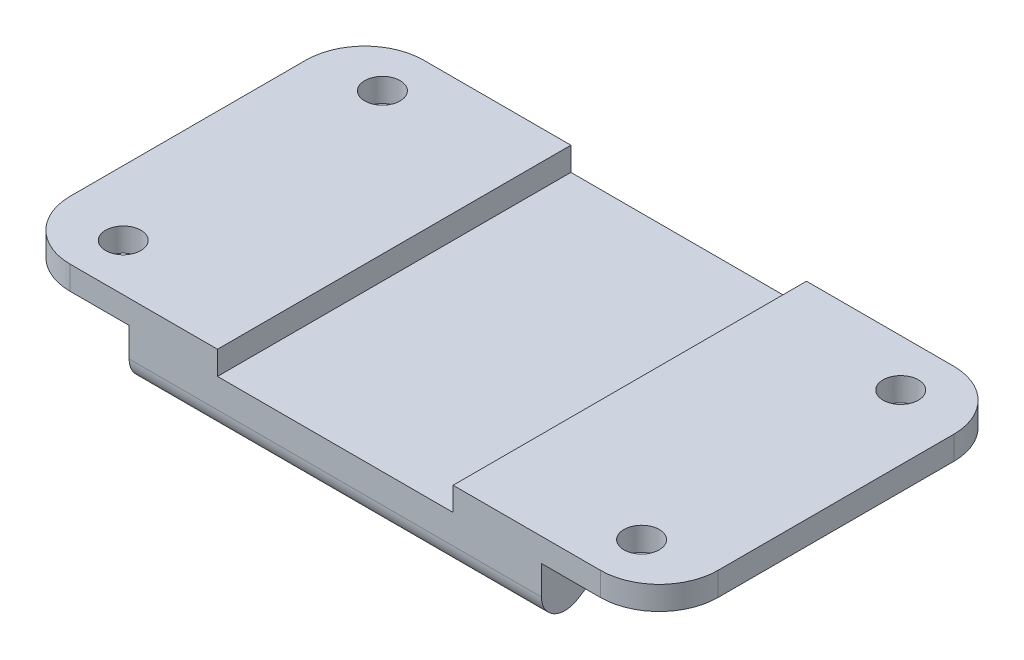
ISO-10303-21;
HEADER;
FILE_DESCRIPTION(('STEP AP214'),'2;1');
FILE_NAME('part.step','',(''),(''),'','','');
FILE_SCHEMA(('AUTOMOTIVE_DESIGN { 1 0 10303 214 1 1 1 1 }'));
ENDSEC;
DATA;
#1=APPLICATION_CONTEXT('core data for automotive mechanical design processes');
#2=APPLICATION_PROTOCOL_DEFINITION('international standard','automotive_design',2000,#1);
#3=PRODUCT_CONTEXT('',#1,'mechanical');
#4=PRODUCT('Part','Part','',(#3));
#5=PRODUCT_RELATED_PRODUCT_CATEGORY('part','',(#4));
#6=PRODUCT_DEFINITION_FORMATION('','',#4);
#7=PRODUCT_DEFINITION_CONTEXT('part definition',#1,'design');
#8=PRODUCT_DEFINITION('design','',#6,#7);
#9=PRODUCT_DEFINITION_SHAPE('','',#8);
#10=(LENGTH_UNIT() NAMED_UNIT(*) SI_UNIT(.MILLI.,.METRE.));
#11=(NAMED_UNIT(*) PLANE_ANGLE_UNIT() SI_UNIT($,.RADIAN.));
#12=(NAMED_UNIT(*) SI_UNIT($,.STERADIAN.) SOLID_ANGLE_UNIT());
#13=UNCERTAINTY_MEASURE_WITH_UNIT(LENGTH_MEASURE(1.E-05),#10,'distance_accuracy_value','');
#14=(GEOMETRIC_REPRESENTATION_CONTEXT(3) GLOBAL_UNCERTAINTY_ASSIGNED_CONTEXT((#13)) GLOBAL_UNIT_ASSIGNED_CONTEXT((#10,
#11,#12)) REPRESENTATION_CONTEXT('',''));
#15=CARTESIAN_POINT('',(0.,0.,0.));
#16=DIRECTION('',(0.,0.,1.));
#17=DIRECTION('',(1.,0.,0.));
#18=AXIS2_PLACEMENT_3D('',#15,#16,#17);
#19=CARTESIAN_POINT('',(0.,0.,0.));
#20=DIRECTION('',(0.,1.,0.));
#21=DIRECTION('',(0.,0.,1.));
#22=AXIS2_PLACEMENT_3D('',#19,#20,#21);
#23=PLANE('',#22);
#24=CARTESIAN_POINT('',(22.,0.,11.));
#25=DIRECTION('',(0.,1.,0.));
#26=DIRECTION('',(0.,0.,1.));
#27=AXIS2_PLACEMENT_3D('',#24,#25,#26);
#28=CIRCLE('',#27,1.5);
#29=CARTESIAN_POINT('',(22.,0.,12.5));
#30=VERTEX_POINT('',#29);
#31=EDGE_CURVE('E431',#30,#30,#28,.T.);
#32=ORIENTED_EDGE('',*,*,#31,.F.);
#33=EDGE_LOOP('',(#32));
#34=FACE_BOUND('',#33,.T.);
#35=CARTESIAN_POINT('',(22.,0.,-11.));
#36=DIRECTION('',(0.,1.,0.));
#37=DIRECTION('',(0.,0.,1.));
#38=AXIS2_PLACEMENT_3D('',#35,#36,#37);
#39=CIRCLE('',#38,1.5);
#40=CARTESIAN_POINT('',(22.,0.,-9.49999999999999));
#41=VERTEX_POINT('',#40);
#42=EDGE_CURVE('E446',#41,#41,#39,.F.);
#43=ORIENTED_EDGE('',*,*,#42,.T.);
#44=EDGE_LOOP('',(#43));
#45=FACE_BOUND('',#44,.T.);
#46=DIRECTION('',(1.,0.,0.));
#47=VECTOR('',#46,1.);
#48=CARTESIAN_POINT('',(17.5,0.,15.));
#49=LINE('',#48,#47);
#50=CARTESIAN_POINT('',(10.,0.,15.));
#51=VERTEX_POINT('',#50);
#52=CARTESIAN_POINT('',(22.5,0.,15.));
#53=VERTEX_POINT('',#52);
#54=EDGE_CURVE('E213',#51,#53,#49,.T.);
#55=ORIENTED_EDGE('',*,*,#54,.T.);
#56=CARTESIAN_POINT('',(22.5,0.,9.99999999999999));
#57=DIRECTION('',(0.,1.,0.));
#58=DIRECTION('',(0.,0.,1.));
#59=AXIS2_PLACEMENT_3D('',#56,#57,#58);
#60=CIRCLE('',#59,5.);
#61=CARTESIAN_POINT('',(27.5,0.,9.99999999999999));
#62=VERTEX_POINT('',#61);
#63=EDGE_CURVE('E288',#53,#62,#60,.T.);
#64=ORIENTED_EDGE('',*,*,#63,.T.);
#65=DIRECTION('',(0.,0.,-1.));
#66=VECTOR('',#65,1.);
#67=CARTESIAN_POINT('',(27.5,0.,0.));
#68=LINE('',#67,#66);
#69=CARTESIAN_POINT('',(27.5,0.,-10.));
#70=VERTEX_POINT('',#69);
#71=EDGE_CURVE('E375',#62,#70,#68,.T.);
#72=ORIENTED_EDGE('',*,*,#71,.T.);
#73=CARTESIAN_POINT('',(22.5,0.,-10.));
#74=DIRECTION('',(0.,1.,0.));
#75=DIRECTION('',(0.,0.,1.));
#76=AXIS2_PLACEMENT_3D('',#73,#74,#75);
#77=CIRCLE('',#76,5.);
#78=CARTESIAN_POINT('',(22.5,0.,-15.));
#79=VERTEX_POINT('',#78);
#80=EDGE_CURVE('E286',#70,#79,#77,.T.);
#81=ORIENTED_EDGE('',*,*,#80,.T.);
#82=DIRECTION('',(-1.,0.,0.));
#83=VECTOR('',#82,1.);
#84=CARTESIAN_POINT('',(17.5,0.,-15.));
#85=LINE('',#84,#83);
#86=CARTESIAN_POINT('',(10.,0.,-15.));
#87=VERTEX_POINT('',#86);
#88=EDGE_CURVE('E210',#79,#87,#85,.T.);
#89=ORIENTED_EDGE('',*,*,#88,.T.);
#90=DIRECTION('',(0.,0.,1.));
#91=VECTOR('',#90,1.);
#92=CARTESIAN_POINT('',(10.,0.,-15.));
#93=LINE('',#92,#91);
#94=EDGE_CURVE('E362',#87,#51,#93,.T.);
#95=ORIENTED_EDGE('',*,*,#94,.T.);
#96=EDGE_LOOP('',(#55,#64,#72,#81,#89,#95));
#97=FACE_BOUND('',#96,.T.);
#98=ADVANCED_FACE('F35',(#34,#45,#97),#23,.T.);
#99=CARTESIAN_POINT('',(17.5,-8.,-15.));
#100=DIRECTION('',(0.,0.,-1.));
#101=DIRECTION('',(-1.,0.,0.));
#102=AXIS2_PLACEMENT_3D('',#99,#100,#101);
#103=PLANE('',#102);
#104=ORIENTED_EDGE('',*,*,#88,.F.);
#105=DIRECTION('',(0.,-1.,0.));
#106=VECTOR('',#105,1.);
#107=CARTESIAN_POINT('',(22.5,-8.,-15.));
#108=LINE('',#107,#106);
#109=CARTESIAN_POINT('',(22.5,-2.,-15.));
#110=VERTEX_POINT('',#109);
#111=EDGE_CURVE('E299',#79,#110,#108,.T.);
#112=ORIENTED_EDGE('',*,*,#111,.T.);
#113=DIRECTION('',(-1.,0.,0.));
#114=VECTOR('',#113,1.);
#115=CARTESIAN_POINT('',(27.5,-2.,-15.));
#116=LINE('',#115,#114);
#117=CARTESIAN_POINT('',(17.5,-2.,-15.));
#118=VERTEX_POINT('',#117);
#119=EDGE_CURVE('E380',#110,#118,#116,.T.);
#120=ORIENTED_EDGE('',*,*,#119,.T.);
#121=DIRECTION('',(0.,1.,0.));
#122=VECTOR('',#121,1.);
#123=CARTESIAN_POINT('',(17.5,-8.,-15.));
#124=LINE('',#123,#122);
#125=CARTESIAN_POINT('',(17.5,-4.46761924206188,-15.));
#126=VERTEX_POINT('',#125);
#127=EDGE_CURVE('E221',#126,#118,#124,.T.);
#128=ORIENTED_EDGE('',*,*,#127,.F.);
#129=DIRECTION('',(-1.,0.,0.));
#130=VECTOR('',#129,1.);
#131=CARTESIAN_POINT('',(-17.5,-4.46761924206188,-15.));
#132=LINE('',#131,#130);
#133=CARTESIAN_POINT('',(-17.5,-4.46761924206188,-15.));
#134=VERTEX_POINT('',#133);
#135=EDGE_CURVE('E245',#126,#134,#132,.T.);
#136=ORIENTED_EDGE('',*,*,#135,.T.);
#137=DIRECTION('',(0.,1.,0.));
#138=VECTOR('',#137,1.);
#139=CARTESIAN_POINT('',(-17.5,-8.,-15.));
#140=LINE('',#139,#138);
#141=CARTESIAN_POINT('',(-17.5,-2.,-15.));
#142=VERTEX_POINT('',#141);
#143=EDGE_CURVE('E217',#134,#142,#140,.T.);
#144=ORIENTED_EDGE('',*,*,#143,.T.);
#145=DIRECTION('',(1.,0.,0.));
#146=VECTOR('',#145,1.);
#147=CARTESIAN_POINT('',(-27.5,-2.,-15.));
#148=LINE('',#147,#146);
#149=CARTESIAN_POINT('',(-22.5,-2.,-15.));
#150=VERTEX_POINT('',#149);
#151=EDGE_CURVE('E338',#150,#142,#148,.T.);
#152=ORIENTED_EDGE('',*,*,#151,.F.);
#153=DIRECTION('',(0.,-1.,0.));
#154=VECTOR('',#153,1.);
#155=CARTESIAN_POINT('',(-22.5,-8.,-15.));
#156=LINE('',#155,#154);
#157=CARTESIAN_POINT('',(-22.5,0.,-15.));
#158=VERTEX_POINT('',#157);
#159=EDGE_CURVE('E209',#150,#158,#156,.F.);
#160=ORIENTED_EDGE('',*,*,#159,.T.);
#161=CARTESIAN_POINT('',(-10.,0.,-15.));
#162=VERTEX_POINT('',#161);
#163=EDGE_CURVE('E200',#162,#158,#85,.T.);
#164=ORIENTED_EDGE('',*,*,#163,.F.);
#165=DIRECTION('',(0.,-1.,0.));
#166=VECTOR('',#165,1.);
#167=CARTESIAN_POINT('',(-10.,0.,-15.));
#168=LINE('',#167,#166);
#169=CARTESIAN_POINT('',(-10.,-2.,-15.));
#170=VERTEX_POINT('',#169);
#171=EDGE_CURVE('E184',#162,#170,#168,.T.);
#172=ORIENTED_EDGE('',*,*,#171,.T.);
#173=DIRECTION('',(1.,0.,0.));
#174=VECTOR('',#173,1.);
#175=CARTESIAN_POINT('',(0.,-2.,-15.));
#176=LINE('',#175,#174);
#177=CARTESIAN_POINT('',(10.,-2.,-15.));
#178=VERTEX_POINT('',#177);
#179=EDGE_CURVE('E195',#170,#178,#176,.T.);
#180=ORIENTED_EDGE('',*,*,#179,.T.);
#181=DIRECTION('',(0.,-1.,0.));
#182=VECTOR('',#181,1.);
#183=CARTESIAN_POINT('',(10.,0.,-15.));
#184=LINE('',#183,#182);
#185=EDGE_CURVE('E203',#87,#178,#184,.T.);
#186=ORIENTED_EDGE('',*,*,#185,.F.);
#187=EDGE_LOOP('',(#104,#112,#120,#128,#136,#144,#152,#160,#164,#172,#180,#186));
#188=FACE_BOUND('',#187,.T.);
#189=ADVANCED_FACE('F206',(#188),#103,.T.);
#190=CARTESIAN_POINT('',(17.5,-8.,15.));
#191=DIRECTION('',(0.,0.,1.));
#192=DIRECTION('',(1.,0.,0.));
#193=AXIS2_PLACEMENT_3D('',#190,#191,#192);
#194=PLANE('',#193);
#195=DIRECTION('',(-1.,0.,0.));
#196=VECTOR('',#195,1.);
#197=CARTESIAN_POINT('',(27.5,-2.,15.));
#198=LINE('',#197,#196);
#199=CARTESIAN_POINT('',(22.5,-2.,15.));
#200=VERTEX_POINT('',#199);
#201=CARTESIAN_POINT('',(17.5,-2.,15.));
#202=VERTEX_POINT('',#201);
#203=EDGE_CURVE('E332',#200,#202,#198,.T.);
#204=ORIENTED_EDGE('',*,*,#203,.F.);
#205=DIRECTION('',(0.,1.,0.));
#206=VECTOR('',#205,1.);
#207=CARTESIAN_POINT('',(22.5,-8.,15.));
#208=LINE('',#207,#206);
#209=EDGE_CURVE('E283',#200,#53,#208,.T.);
#210=ORIENTED_EDGE('',*,*,#209,.T.);
#211=ORIENTED_EDGE('',*,*,#54,.F.);
#212=DIRECTION('',(0.,-1.,0.));
#213=VECTOR('',#212,1.);
#214=CARTESIAN_POINT('',(10.,0.,15.));
#215=LINE('',#214,#213);
#216=CARTESIAN_POINT('',(10.,-2.,15.));
#217=VERTEX_POINT('',#216);
#218=EDGE_CURVE('E196',#51,#217,#215,.T.);
#219=ORIENTED_EDGE('',*,*,#218,.T.);
#220=DIRECTION('',(1.,0.,0.));
#221=VECTOR('',#220,1.);
#222=CARTESIAN_POINT('',(0.,-2.,15.));
#223=LINE('',#222,#221);
#224=CARTESIAN_POINT('',(-10.,-2.,15.));
#225=VERTEX_POINT('',#224);
#226=EDGE_CURVE('E438',#225,#217,#223,.T.);
#227=ORIENTED_EDGE('',*,*,#226,.F.);
#228=DIRECTION('',(0.,-1.,0.));
#229=VECTOR('',#228,1.);
#230=CARTESIAN_POINT('',(-10.,0.,15.));
#231=LINE('',#230,#229);
#232=CARTESIAN_POINT('',(-10.,0.,15.));
#233=VERTEX_POINT('',#232);
#234=EDGE_CURVE('E316',#233,#225,#231,.T.);
#235=ORIENTED_EDGE('',*,*,#234,.F.);
#236=CARTESIAN_POINT('',(-22.5,0.,15.));
#237=VERTEX_POINT('',#236);
#238=EDGE_CURVE('E202',#237,#233,#49,.T.);
#239=ORIENTED_EDGE('',*,*,#238,.F.);
#240=DIRECTION('',(0.,1.,0.));
#241=VECTOR('',#240,1.);
#242=CARTESIAN_POINT('',(-22.5,-8.,15.));
#243=LINE('',#242,#241);
#244=CARTESIAN_POINT('',(-22.5,-2.,15.));
#245=VERTEX_POINT('',#244);
#246=EDGE_CURVE('E267',#237,#245,#243,.F.);
#247=ORIENTED_EDGE('',*,*,#246,.T.);
#248=DIRECTION('',(1.,0.,0.));
#249=VECTOR('',#248,1.);
#250=CARTESIAN_POINT('',(-27.5,-2.,15.));
#251=LINE('',#250,#249);
#252=CARTESIAN_POINT('',(-17.5,-2.,15.));
#253=VERTEX_POINT('',#252);
#254=EDGE_CURVE('E325',#245,#253,#251,.T.);
#255=ORIENTED_EDGE('',*,*,#254,.T.);
#256=DIRECTION('',(0.,1.,0.));
#257=VECTOR('',#256,1.);
#258=CARTESIAN_POINT('',(-17.5,-8.,15.));
#259=LINE('',#258,#257);
#260=CARTESIAN_POINT('',(-17.5,-4.46761924206188,15.));
#261=VERTEX_POINT('',#260);
#262=EDGE_CURVE('E212',#261,#253,#259,.T.);
#263=ORIENTED_EDGE('',*,*,#262,.F.);
#264=DIRECTION('',(1.,0.,0.));
#265=VECTOR('',#264,1.);
#266=CARTESIAN_POINT('',(17.5,-4.46761924206188,15.));
#267=LINE('',#266,#265);
#268=CARTESIAN_POINT('',(17.5,-4.46761924206188,15.));
#269=VERTEX_POINT('',#268);
#270=EDGE_CURVE('E256',#261,#269,#267,.T.);
#271=ORIENTED_EDGE('',*,*,#270,.T.);
#272=DIRECTION('',(0.,1.,0.));
#273=VECTOR('',#272,1.);
#274=CARTESIAN_POINT('',(17.5,-8.,15.));
#275=LINE('',#274,#273);
#276=EDGE_CURVE('E224',#269,#202,#275,.T.);
#277=ORIENTED_EDGE('',*,*,#276,.T.);
#278=EDGE_LOOP('',(#204,#210,#211,#219,#227,#235,#239,#247,#255,#263,#271,#277));
#279=FACE_BOUND('',#278,.T.);
#280=ADVANCED_FACE('F313',(#279),#194,.T.);
#281=ORIENTED_EDGE('',*,*,#163,.T.);
#282=CARTESIAN_POINT('',(-22.5,0.,-10.));
#283=DIRECTION('',(0.,1.,0.));
#284=DIRECTION('',(0.,0.,1.));
#285=AXIS2_PLACEMENT_3D('',#282,#283,#284);
#286=CIRCLE('',#285,5.);
#287=CARTESIAN_POINT('',(-27.5,0.,-10.));
#288=VERTEX_POINT('',#287);
#289=EDGE_CURVE('E11',#158,#288,#286,.T.);
#290=ORIENTED_EDGE('',*,*,#289,.T.);
#291=DIRECTION('',(0.,0.,-1.));
#292=VECTOR('',#291,1.);
#293=CARTESIAN_POINT('',(-27.5,0.,0.));
#294=LINE('',#293,#292);
#295=CARTESIAN_POINT('',(-27.5,0.,9.99999999999999));
#296=VERTEX_POINT('',#295);
#297=EDGE_CURVE('E310',#296,#288,#294,.T.);
#298=ORIENTED_EDGE('',*,*,#297,.F.);
#299=CARTESIAN_POINT('',(-22.5,0.,9.99999999999999));
#300=DIRECTION('',(0.,1.,0.));
#301=DIRECTION('',(0.,0.,1.));
#302=AXIS2_PLACEMENT_3D('',#299,#300,#301);
#303=CIRCLE('',#302,5.);
#304=EDGE_CURVE('E43',#296,#237,#303,.T.);
#305=ORIENTED_EDGE('',*,*,#304,.T.);
#306=ORIENTED_EDGE('',*,*,#238,.T.);
#307=DIRECTION('',(0.,0.,1.));
#308=VECTOR('',#307,1.);
#309=CARTESIAN_POINT('',(-10.,0.,-15.));
#310=LINE('',#309,#308);
#311=EDGE_CURVE('E188',#162,#233,#310,.T.);
#312=ORIENTED_EDGE('',*,*,#311,.F.);
#313=EDGE_LOOP('',(#281,#290,#298,#305,#306,#312));
#314=FACE_BOUND('',#313,.T.);
#315=CARTESIAN_POINT('',(-22.,0.,-11.));
#316=DIRECTION('',(0.,1.,0.));
#317=DIRECTION('',(0.,0.,1.));
#318=AXIS2_PLACEMENT_3D('',#315,#316,#317);
#319=CIRCLE('',#318,1.5);
#320=CARTESIAN_POINT('',(-22.,0.,-9.49999999999999));
#321=VERTEX_POINT('',#320);
#322=EDGE_CURVE('E272',#321,#321,#319,.T.);
#323=ORIENTED_EDGE('',*,*,#322,.F.);
#324=EDGE_LOOP('',(#323));
#325=FACE_BOUND('',#324,.T.);
#326=CARTESIAN_POINT('',(-22.,0.,11.));
#327=DIRECTION('',(0.,1.,0.));
#328=DIRECTION('',(0.,0.,1.));
#329=AXIS2_PLACEMENT_3D('',#326,#327,#328);
#330=CIRCLE('',#329,1.5);
#331=CARTESIAN_POINT('',(-22.,0.,12.5));
#332=VERTEX_POINT('',#331);
#333=EDGE_CURVE('E447',#332,#332,#330,.F.);
#334=ORIENTED_EDGE('',*,*,#333,.T.);
#335=EDGE_LOOP('',(#334));
#336=FACE_BOUND('',#335,.T.);
#337=ADVANCED_FACE('F198',(#314,#325,#336),#23,.T.);
#338=CARTESIAN_POINT('',(-27.5,-2.,0.));
#339=DIRECTION('',(0.,1.,0.));
#340=DIRECTION('',(0.,0.,1.));
#341=AXIS2_PLACEMENT_3D('',#338,#339,#340);
#342=PLANE('',#341);
#343=CARTESIAN_POINT('',(-22.,-2.,-11.));
#344=DIRECTION('',(0.,1.,0.));
#345=DIRECTION('',(0.,0.,1.));
#346=AXIS2_PLACEMENT_3D('',#343,#344,#345);
#347=CIRCLE('',#346,1.5);
#348=CARTESIAN_POINT('',(-22.,-2.,-9.49999999999999));
#349=VERTEX_POINT('',#348);
#350=EDGE_CURVE('E275',#349,#349,#347,.T.);
#351=ORIENTED_EDGE('',*,*,#350,.T.);
#352=EDGE_LOOP('',(#351));
#353=FACE_BOUND('',#352,.T.);
#354=DIRECTION('',(0.,0.,1.));
#355=VECTOR('',#354,1.);
#356=CARTESIAN_POINT('',(-27.5,-2.,0.));
#357=LINE('',#356,#355);
#358=CARTESIAN_POINT('',(-27.5,-2.,-10.));
#359=VERTEX_POINT('',#358);
#360=CARTESIAN_POINT('',(-27.5,-2.,9.99999999999999));
#361=VERTEX_POINT('',#360);
#362=EDGE_CURVE('E323',#359,#361,#357,.T.);
#363=ORIENTED_EDGE('',*,*,#362,.F.);
#364=CARTESIAN_POINT('',(-22.5,-2.,-10.));
#365=DIRECTION('',(0.,1.,0.));
#366=DIRECTION('',(0.,0.,1.));
#367=AXIS2_PLACEMENT_3D('',#364,#365,#366);
#368=CIRCLE('',#367,5.);
#369=EDGE_CURVE('E309',#359,#150,#368,.F.);
#370=ORIENTED_EDGE('',*,*,#369,.T.);
#371=ORIENTED_EDGE('',*,*,#151,.T.);
#372=DIRECTION('',(0.,0.,1.));
#373=VECTOR('',#372,1.);
#374=CARTESIAN_POINT('',(-17.5,-2.,0.));
#375=LINE('',#374,#373);
#376=EDGE_CURVE('E329',#142,#253,#375,.T.);
#377=ORIENTED_EDGE('',*,*,#376,.T.);
#378=ORIENTED_EDGE('',*,*,#254,.F.);
#379=CARTESIAN_POINT('',(-22.5,-2.,9.99999999999999));
#380=DIRECTION('',(0.,1.,0.));
#381=DIRECTION('',(0.,0.,1.));
#382=AXIS2_PLACEMENT_3D('',#379,#380,#381);
#383=CIRCLE('',#382,5.);
#384=EDGE_CURVE('E307',#245,#361,#383,.F.);
#385=ORIENTED_EDGE('',*,*,#384,.T.);
#386=EDGE_LOOP('',(#363,#370,#371,#377,#378,#385));
#387=FACE_BOUND('',#386,.T.);
#388=CARTESIAN_POINT('',(-22.,-2.,11.));
#389=DIRECTION('',(0.,1.,0.));
#390=DIRECTION('',(0.,0.,1.));
#391=AXIS2_PLACEMENT_3D('',#388,#389,#390);
#392=CIRCLE('',#391,1.5);
#393=CARTESIAN_POINT('',(-22.,-2.,12.5));
#394=VERTEX_POINT('',#393);
#395=EDGE_CURVE('E278',#394,#394,#392,.F.);
#396=ORIENTED_EDGE('',*,*,#395,.F.);
#397=EDGE_LOOP('',(#396));
#398=FACE_BOUND('',#397,.T.);
#399=ADVANCED_FACE('F321',(#353,#387,#398),#342,.F.);
#400=CARTESIAN_POINT('',(27.5,-2.,0.));
#401=DIRECTION('',(0.,-1.,0.));
#402=DIRECTION('',(0.,0.,-1.));
#403=AXIS2_PLACEMENT_3D('',#400,#401,#402);
#404=PLANE('',#403);
#405=DIRECTION('',(0.,0.,1.));
#406=VECTOR('',#405,1.);
#407=CARTESIAN_POINT('',(27.5,-2.,0.));
#408=LINE('',#407,#406);
#409=CARTESIAN_POINT('',(27.5,-2.,-10.));
#410=VERTEX_POINT('',#409);
#411=CARTESIAN_POINT('',(27.5,-2.,9.99999999999999));
#412=VERTEX_POINT('',#411);
#413=EDGE_CURVE('E373',#410,#412,#408,.T.);
#414=ORIENTED_EDGE('',*,*,#413,.T.);
#415=CARTESIAN_POINT('',(22.5,-2.,9.99999999999999));
#416=DIRECTION('',(0.,-1.,0.));
#417=DIRECTION('',(0.,0.,-1.));
#418=AXIS2_PLACEMENT_3D('',#415,#416,#417);
#419=CIRCLE('',#418,5.);
#420=EDGE_CURVE('E296',#412,#200,#419,.T.);
#421=ORIENTED_EDGE('',*,*,#420,.T.);
#422=ORIENTED_EDGE('',*,*,#203,.T.);
#423=DIRECTION('',(0.,0.,1.));
#424=VECTOR('',#423,1.);
#425=CARTESIAN_POINT('',(17.5,-2.,0.));
#426=LINE('',#425,#424);
#427=EDGE_CURVE('E281',#118,#202,#426,.T.);
#428=ORIENTED_EDGE('',*,*,#427,.F.);
#429=ORIENTED_EDGE('',*,*,#119,.F.);
#430=CARTESIAN_POINT('',(22.5,-2.,-10.));
#431=DIRECTION('',(0.,-1.,0.));
#432=DIRECTION('',(0.,0.,-1.));
#433=AXIS2_PLACEMENT_3D('',#430,#431,#432);
#434=CIRCLE('',#433,5.);
#435=EDGE_CURVE('E294',#110,#410,#434,.T.);
#436=ORIENTED_EDGE('',*,*,#435,.T.);
#437=EDGE_LOOP('',(#414,#421,#422,#428,#429,#436));
#438=FACE_BOUND('',#437,.T.);
#439=CARTESIAN_POINT('',(22.,-2.,11.));
#440=DIRECTION('',(0.,-1.,0.));
#441=DIRECTION('',(0.,0.,-1.));
#442=AXIS2_PLACEMENT_3D('',#439,#440,#441);
#443=CIRCLE('',#442,1.5);
#444=CARTESIAN_POINT('',(22.,-2.,9.5));
#445=VERTEX_POINT('',#444);
#446=EDGE_CURVE('E268',#445,#445,#443,.T.);
#447=ORIENTED_EDGE('',*,*,#446,.F.);
#448=EDGE_LOOP('',(#447));
#449=FACE_BOUND('',#448,.T.);
#450=CARTESIAN_POINT('',(22.,-2.,-11.));
#451=DIRECTION('',(0.,-1.,0.));
#452=DIRECTION('',(0.,0.,-1.));
#453=AXIS2_PLACEMENT_3D('',#450,#451,#452);
#454=CIRCLE('',#453,1.5);
#455=CARTESIAN_POINT('',(22.,-2.,-12.5));
#456=VERTEX_POINT('',#455);
#457=EDGE_CURVE('E271',#456,#456,#454,.F.);
#458=ORIENTED_EDGE('',*,*,#457,.T.);
#459=EDGE_LOOP('',(#458));
#460=FACE_BOUND('',#459,.T.);
#461=ADVANCED_FACE('F377',(#438,#449,#460),#404,.T.);
#462=CARTESIAN_POINT('',(17.5,-8.,15.));
#463=DIRECTION('',(1.,0.,0.));
#464=DIRECTION('',(0.,0.,-1.));
#465=AXIS2_PLACEMENT_3D('',#462,#463,#464);
#466=PLANE('',#465);
#467=ORIENTED_EDGE('',*,*,#127,.T.);
#468=ORIENTED_EDGE('',*,*,#427,.T.);
#469=ORIENTED_EDGE('',*,*,#276,.F.);
#470=CARTESIAN_POINT('',(17.5,-4.46761924206188,13.));
#471=DIRECTION('',(1.,0.,0.));
#472=DIRECTION('',(0.,0.,-1.));
#473=AXIS2_PLACEMENT_3D('',#470,#471,#472);
#474=CIRCLE('',#473,2.);
#475=CARTESIAN_POINT('',(17.5,-6.18260509348697,11.9710084891449));
#476=VERTEX_POINT('',#475);
#477=EDGE_CURVE('E252',#269,#476,#474,.T.);
#478=ORIENTED_EDGE('',*,*,#477,.T.);
#479=DIRECTION('',(0.,0.514495755427527,-0.857492925712544));
#480=VECTOR('',#479,1.);
#481=CARTESIAN_POINT('',(17.5,-8.,15.));
#482=LINE('',#481,#480);
#483=CARTESIAN_POINT('',(17.5,-5.28501414857491,10.4750235809582));
#484=VERTEX_POINT('',#483);
#485=EDGE_CURVE('E351',#476,#484,#482,.T.);
#486=ORIENTED_EDGE('',*,*,#485,.T.);
#487=CARTESIAN_POINT('',(17.5,-7.,9.44603207010313));
#488=DIRECTION('',(1.,0.,0.));
#489=DIRECTION('',(0.,0.,-1.));
#490=AXIS2_PLACEMENT_3D('',#487,#488,#489);
#491=CIRCLE('',#490,2.);
#492=CARTESIAN_POINT('',(17.5,-5.,9.44603207010313));
#493=VERTEX_POINT('',#492);
#494=EDGE_CURVE('E259',#484,#493,#491,.F.);
#495=ORIENTED_EDGE('',*,*,#494,.T.);
#496=DIRECTION('',(0.,0.,-1.));
#497=VECTOR('',#496,1.);
#498=CARTESIAN_POINT('',(17.5,-5.,15.));
#499=LINE('',#498,#497);
#500=CARTESIAN_POINT('',(17.5,-5.,-9.44603207010313));
#501=VERTEX_POINT('',#500);
#502=EDGE_CURVE('E220',#493,#501,#499,.T.);
#503=ORIENTED_EDGE('',*,*,#502,.T.);
#504=CARTESIAN_POINT('',(17.5,-7.,-9.44603207010313));
#505=DIRECTION('',(1.,0.,0.));
#506=DIRECTION('',(0.,0.,-1.));
#507=AXIS2_PLACEMENT_3D('',#504,#505,#506);
#508=CIRCLE('',#507,2.);
#509=CARTESIAN_POINT('',(17.5,-5.28501414857491,-10.4750235809582));
#510=VERTEX_POINT('',#509);
#511=EDGE_CURVE('E263',#501,#510,#508,.F.);
#512=ORIENTED_EDGE('',*,*,#511,.T.);
#513=DIRECTION('',(0.,0.514495755427526,0.857492925712545));
#514=VECTOR('',#513,1.);
#515=CARTESIAN_POINT('',(17.5,5.23529411764705,7.05882352941178));
#516=LINE('',#515,#514);
#517=CARTESIAN_POINT('',(17.5,-6.18260509348698,-11.971008489145));
#518=VERTEX_POINT('',#517);
#519=EDGE_CURVE('E349',#518,#510,#516,.T.);
#520=ORIENTED_EDGE('',*,*,#519,.F.);
#521=CARTESIAN_POINT('',(17.5,-4.46761924206188,-13.));
#522=DIRECTION('',(1.,0.,0.));
#523=DIRECTION('',(0.,0.,-1.));
#524=AXIS2_PLACEMENT_3D('',#521,#522,#523);
#525=CIRCLE('',#524,2.);
#526=EDGE_CURVE('E254',#518,#126,#525,.T.);
#527=ORIENTED_EDGE('',*,*,#526,.T.);
#528=EDGE_LOOP('',(#467,#468,#469,#478,#486,#495,#503,#512,#520,#527));
#529=FACE_BOUND('',#528,.T.);
#530=ADVANCED_FACE('F388',(#529),#466,.T.);
#531=CARTESIAN_POINT('',(-17.5,-8.,15.));
#532=DIRECTION('',(-1.,0.,0.));
#533=DIRECTION('',(0.,0.,1.));
#534=AXIS2_PLACEMENT_3D('',#531,#532,#533);
#535=PLANE('',#534);
#536=ORIENTED_EDGE('',*,*,#376,.F.);
#537=ORIENTED_EDGE('',*,*,#143,.F.);
#538=CARTESIAN_POINT('',(-17.5,-4.46761924206188,-13.));
#539=DIRECTION('',(-1.,0.,0.));
#540=DIRECTION('',(0.,0.,1.));
#541=AXIS2_PLACEMENT_3D('',#538,#539,#540);
#542=CIRCLE('',#541,2.);
#543=CARTESIAN_POINT('',(-17.5,-6.18260509348697,-11.971008489145));
#544=VERTEX_POINT('',#543);
#545=EDGE_CURVE('E250',#134,#544,#542,.T.);
#546=ORIENTED_EDGE('',*,*,#545,.T.);
#547=DIRECTION('',(0.,0.514495755427526,0.857492925712545));
#548=VECTOR('',#547,1.);
#549=CARTESIAN_POINT('',(-17.5,0.735294117647051,-0.44117647058823));
#550=LINE('',#549,#548);
#551=CARTESIAN_POINT('',(-17.5,-5.28501414857491,-10.4750235809582));
#552=VERTEX_POINT('',#551);
#553=EDGE_CURVE('E340',#544,#552,#550,.T.);
#554=ORIENTED_EDGE('',*,*,#553,.T.);
#555=CARTESIAN_POINT('',(-17.5,-7.,-9.44603207010313));
#556=DIRECTION('',(-1.,0.,0.));
#557=DIRECTION('',(0.,0.,1.));
#558=AXIS2_PLACEMENT_3D('',#555,#556,#557);
#559=CIRCLE('',#558,2.);
#560=CARTESIAN_POINT('',(-17.5,-5.,-9.44603207010313));
#561=VERTEX_POINT('',#560);
#562=EDGE_CURVE('E265',#552,#561,#559,.F.);
#563=ORIENTED_EDGE('',*,*,#562,.T.);
#564=DIRECTION('',(0.,0.,-1.));
#565=VECTOR('',#564,1.);
#566=CARTESIAN_POINT('',(-17.5,-5.,0.));
#567=LINE('',#566,#565);
#568=CARTESIAN_POINT('',(-17.5,-5.,9.44603207010313));
#569=VERTEX_POINT('',#568);
#570=EDGE_CURVE('E343',#569,#561,#567,.T.);
#571=ORIENTED_EDGE('',*,*,#570,.F.);
#572=CARTESIAN_POINT('',(-17.5,-7.,9.44603207010313));
#573=DIRECTION('',(-1.,0.,0.));
#574=DIRECTION('',(0.,0.,1.));
#575=AXIS2_PLACEMENT_3D('',#572,#573,#574);
#576=CIRCLE('',#575,2.);
#577=CARTESIAN_POINT('',(-17.5,-5.28501414857491,10.4750235809582));
#578=VERTEX_POINT('',#577);
#579=EDGE_CURVE('E261',#569,#578,#576,.F.);
#580=ORIENTED_EDGE('',*,*,#579,.T.);
#581=DIRECTION('',(0.,0.514495755427527,-0.857492925712544));
#582=VECTOR('',#581,1.);
#583=CARTESIAN_POINT('',(-17.5,0.735294117647056,0.441176470588234));
#584=LINE('',#583,#582);
#585=CARTESIAN_POINT('',(-17.5,-6.18260509348697,11.9710084891449));
#586=VERTEX_POINT('',#585);
#587=EDGE_CURVE('E346',#586,#578,#584,.T.);
#588=ORIENTED_EDGE('',*,*,#587,.F.);
#589=CARTESIAN_POINT('',(-17.5,-4.46761924206188,13.));
#590=DIRECTION('',(-1.,0.,0.));
#591=DIRECTION('',(0.,0.,1.));
#592=AXIS2_PLACEMENT_3D('',#589,#590,#591);
#593=CIRCLE('',#592,2.);
#594=EDGE_CURVE('E248',#586,#261,#593,.T.);
#595=ORIENTED_EDGE('',*,*,#594,.T.);
#596=ORIENTED_EDGE('',*,*,#262,.T.);
#597=EDGE_LOOP('',(#536,#537,#546,#554,#563,#571,#580,#588,#595,#596));
#598=FACE_BOUND('',#597,.T.);
#599=ADVANCED_FACE('F488',(#598),#535,.T.);
#600=CARTESIAN_POINT('',(-17.5,0.735294117647056,0.441176470588234));
#601=DIRECTION('',(0.,-0.857492925712544,-0.514495755427527));
#602=DIRECTION('',(0.,0.514495755427527,-0.857492925712544));
#603=AXIS2_PLACEMENT_3D('',#600,#601,#602);
#604=PLANE('',#603);
#605=ORIENTED_EDGE('',*,*,#587,.T.);
#606=DIRECTION('',(1.,0.,0.));
#607=VECTOR('',#606,1.);
#608=CARTESIAN_POINT('',(17.5,-5.28501414857491,10.4750235809582));
#609=LINE('',#608,#607);
#610=EDGE_CURVE('E233',#578,#484,#609,.T.);
#611=ORIENTED_EDGE('',*,*,#610,.T.);
#612=ORIENTED_EDGE('',*,*,#485,.F.);
#613=DIRECTION('',(1.,0.,0.));
#614=VECTOR('',#613,1.);
#615=CARTESIAN_POINT('',(-17.5,-6.18260509348697,11.9710084891449));
#616=LINE('',#615,#614);
#617=EDGE_CURVE('E231',#476,#586,#616,.F.);
#618=ORIENTED_EDGE('',*,*,#617,.T.);
#619=EDGE_LOOP('',(#605,#611,#612,#618));
#620=FACE_BOUND('',#619,.T.);
#621=ADVANCED_FACE('F397',(#620),#604,.T.);
#622=CARTESIAN_POINT('',(-17.5,-5.,0.));
#623=DIRECTION('',(0.,-1.,0.));
#624=DIRECTION('',(0.,0.,-1.));
#625=AXIS2_PLACEMENT_3D('',#622,#623,#624);
#626=PLANE('',#625);
#627=ORIENTED_EDGE('',*,*,#502,.F.);
#628=DIRECTION('',(1.,0.,0.));
#629=VECTOR('',#628,1.);
#630=CARTESIAN_POINT('',(-17.5,-5.,9.44603207010313));
#631=LINE('',#630,#629);
#632=EDGE_CURVE('E239',#493,#569,#631,.F.);
#633=ORIENTED_EDGE('',*,*,#632,.T.);
#634=ORIENTED_EDGE('',*,*,#570,.T.);
#635=DIRECTION('',(1.,0.,0.));
#636=VECTOR('',#635,1.);
#637=CARTESIAN_POINT('',(-17.5,-5.,-9.44603207010313));
#638=LINE('',#637,#636);
#639=EDGE_CURVE('E236',#561,#501,#638,.T.);
#640=ORIENTED_EDGE('',*,*,#639,.T.);
#641=EDGE_LOOP('',(#627,#633,#634,#640));
#642=FACE_BOUND('',#641,.T.);
#643=ADVANCED_FACE('F406',(#642),#626,.T.);
#644=CARTESIAN_POINT('',(-17.5,0.735294117647051,-0.44117647058823));
#645=DIRECTION('',(0.,0.857492925712545,-0.514495755427526));
#646=DIRECTION('',(0.,0.514495755427526,0.857492925712545));
#647=AXIS2_PLACEMENT_3D('',#644,#645,#646);
#648=PLANE('',#647);
#649=ORIENTED_EDGE('',*,*,#519,.T.);
#650=DIRECTION('',(1.,0.,0.));
#651=VECTOR('',#650,1.);
#652=CARTESIAN_POINT('',(-17.5,-5.28501414857491,-10.4750235809582));
#653=LINE('',#652,#651);
#654=EDGE_CURVE('E243',#510,#552,#653,.F.);
#655=ORIENTED_EDGE('',*,*,#654,.T.);
#656=ORIENTED_EDGE('',*,*,#553,.F.);
#657=DIRECTION('',(-1.,0.,0.));
#658=VECTOR('',#657,1.);
#659=CARTESIAN_POINT('',(17.5,-6.18260509348697,-11.971008489145));
#660=LINE('',#659,#658);
#661=EDGE_CURVE('E241',#544,#518,#660,.F.);
#662=ORIENTED_EDGE('',*,*,#661,.T.);
#663=EDGE_LOOP('',(#649,#655,#656,#662));
#664=FACE_BOUND('',#663,.T.);
#665=ADVANCED_FACE('F416',(#664),#648,.F.);
#666=CARTESIAN_POINT('',(-17.5,-7.,9.44603207010313));
#667=DIRECTION('',(-1.,0.,0.));
#668=DIRECTION('',(0.,0.,1.));
#669=AXIS2_PLACEMENT_3D('',#666,#667,#668);
#670=CYLINDRICAL_SURFACE('',#669,2.);
#671=ORIENTED_EDGE('',*,*,#579,.F.);
#672=ORIENTED_EDGE('',*,*,#632,.F.);
#673=ORIENTED_EDGE('',*,*,#494,.F.);
#674=ORIENTED_EDGE('',*,*,#610,.F.);
#675=EDGE_LOOP('',(#671,#672,#673,#674));
#676=FACE_BOUND('',#675,.T.);
#677=ADVANCED_FACE('F402',(#676),#670,.F.);
#678=CARTESIAN_POINT('',(-17.5,-7.,-9.44603207010313));
#679=DIRECTION('',(1.,0.,0.));
#680=DIRECTION('',(0.,0.,-1.));
#681=AXIS2_PLACEMENT_3D('',#678,#679,#680);
#682=CYLINDRICAL_SURFACE('',#681,2.);
#683=ORIENTED_EDGE('',*,*,#562,.F.);
#684=ORIENTED_EDGE('',*,*,#654,.F.);
#685=ORIENTED_EDGE('',*,*,#511,.F.);
#686=ORIENTED_EDGE('',*,*,#639,.F.);
#687=EDGE_LOOP('',(#683,#684,#685,#686));
#688=FACE_BOUND('',#687,.T.);
#689=ADVANCED_FACE('F411',(#688),#682,.F.);
#690=CARTESIAN_POINT('',(17.5,-4.46761924206188,-13.));
#691=DIRECTION('',(1.,0.,0.));
#692=DIRECTION('',(0.,0.,-1.));
#693=AXIS2_PLACEMENT_3D('',#690,#691,#692);
#694=CYLINDRICAL_SURFACE('',#693,2.);
#695=ORIENTED_EDGE('',*,*,#526,.F.);
#696=ORIENTED_EDGE('',*,*,#661,.F.);
#697=ORIENTED_EDGE('',*,*,#545,.F.);
#698=ORIENTED_EDGE('',*,*,#135,.F.);
#699=EDGE_LOOP('',(#695,#696,#697,#698));
#700=FACE_BOUND('',#699,.T.);
#701=ADVANCED_FACE('F420',(#700),#694,.T.);
#702=CARTESIAN_POINT('',(17.5,-4.46761924206188,13.));
#703=DIRECTION('',(1.,0.,0.));
#704=DIRECTION('',(0.,0.,-1.));
#705=AXIS2_PLACEMENT_3D('',#702,#703,#704);
#706=CYLINDRICAL_SURFACE('',#705,2.);
#707=ORIENTED_EDGE('',*,*,#594,.F.);
#708=ORIENTED_EDGE('',*,*,#617,.F.);
#709=ORIENTED_EDGE('',*,*,#477,.F.);
#710=ORIENTED_EDGE('',*,*,#270,.F.);
#711=EDGE_LOOP('',(#707,#708,#709,#710));
#712=FACE_BOUND('',#711,.T.);
#713=ADVANCED_FACE('F394',(#712),#706,.T.);
#714=CARTESIAN_POINT('',(-27.5,0.,0.));
#715=DIRECTION('',(-1.,0.,0.));
#716=DIRECTION('',(0.,0.,1.));
#717=AXIS2_PLACEMENT_3D('',#714,#715,#716);
#718=PLANE('',#717);
#719=ORIENTED_EDGE('',*,*,#297,.T.);
#720=DIRECTION('',(0.,-1.,0.));
#721=VECTOR('',#720,1.);
#722=CARTESIAN_POINT('',(-27.5,0.,-10.));
#723=LINE('',#722,#721);
#724=EDGE_CURVE('E304',#288,#359,#723,.T.);
#725=ORIENTED_EDGE('',*,*,#724,.T.);
#726=ORIENTED_EDGE('',*,*,#362,.T.);
#727=DIRECTION('',(0.,1.,0.));
#728=VECTOR('',#727,1.);
#729=CARTESIAN_POINT('',(-27.5,0.,9.99999999999999));
#730=LINE('',#729,#728);
#731=EDGE_CURVE('E302',#361,#296,#730,.T.);
#732=ORIENTED_EDGE('',*,*,#731,.T.);
#733=EDGE_LOOP('',(#719,#725,#726,#732));
#734=FACE_BOUND('',#733,.T.);
#735=ADVANCED_FACE('F327',(#734),#718,.T.);
#736=CARTESIAN_POINT('',(27.5,0.,0.));
#737=DIRECTION('',(1.,0.,0.));
#738=DIRECTION('',(0.,0.,1.));
#739=AXIS2_PLACEMENT_3D('',#736,#737,#738);
#740=PLANE('',#739);
#741=ORIENTED_EDGE('',*,*,#71,.F.);
#742=DIRECTION('',(0.,1.,0.));
#743=VECTOR('',#742,1.);
#744=CARTESIAN_POINT('',(27.5,0.,9.99999999999999));
#745=LINE('',#744,#743);
#746=EDGE_CURVE('E292',#62,#412,#745,.F.);
#747=ORIENTED_EDGE('',*,*,#746,.T.);
#748=ORIENTED_EDGE('',*,*,#413,.F.);
#749=DIRECTION('',(0.,-1.,0.));
#750=VECTOR('',#749,1.);
#751=CARTESIAN_POINT('',(27.5,0.,-10.));
#752=LINE('',#751,#750);
#753=EDGE_CURVE('E290',#410,#70,#752,.F.);
#754=ORIENTED_EDGE('',*,*,#753,.T.);
#755=EDGE_LOOP('',(#741,#747,#748,#754));
#756=FACE_BOUND('',#755,.T.);
#757=ADVANCED_FACE('F372',(#756),#740,.T.);
#758=CARTESIAN_POINT('',(22.,-10.,11.));
#759=DIRECTION('',(0.,1.,0.));
#760=DIRECTION('',(0.,0.,1.));
#761=AXIS2_PLACEMENT_3D('',#758,#759,#760);
#762=CYLINDRICAL_SURFACE('',#761,1.5);
#763=ORIENTED_EDGE('',*,*,#446,.T.);
#764=EDGE_LOOP('',(#763));
#765=FACE_BOUND('',#764,.T.);
#766=ORIENTED_EDGE('',*,*,#31,.T.);
#767=EDGE_LOOP('',(#766));
#768=FACE_BOUND('',#767,.T.);
#769=ADVANCED_FACE('F541',(#765,#768),#762,.F.);
#770=CARTESIAN_POINT('',(22.,-10.,-11.));
#771=DIRECTION('',(0.,1.,0.));
#772=DIRECTION('',(0.,0.,1.));
#773=AXIS2_PLACEMENT_3D('',#770,#771,#772);
#774=CYLINDRICAL_SURFACE('',#773,1.5);
#775=ORIENTED_EDGE('',*,*,#457,.F.);
#776=EDGE_LOOP('',(#775));
#777=FACE_BOUND('',#776,.T.);
#778=ORIENTED_EDGE('',*,*,#42,.F.);
#779=EDGE_LOOP('',(#778));
#780=FACE_BOUND('',#779,.T.);
#781=ADVANCED_FACE('F631',(#777,#780),#774,.F.);
#782=CARTESIAN_POINT('',(-22.,-10.,-11.));
#783=DIRECTION('',(0.,1.,0.));
#784=DIRECTION('',(0.,0.,1.));
#785=AXIS2_PLACEMENT_3D('',#782,#783,#784);
#786=CYLINDRICAL_SURFACE('',#785,1.5);
#787=ORIENTED_EDGE('',*,*,#322,.T.);
#788=EDGE_LOOP('',(#787));
#789=FACE_BOUND('',#788,.T.);
#790=ORIENTED_EDGE('',*,*,#350,.F.);
#791=EDGE_LOOP('',(#790));
#792=FACE_BOUND('',#791,.T.);
#793=ADVANCED_FACE('F454',(#789,#792),#786,.F.);
#794=CARTESIAN_POINT('',(-22.,-10.,11.));
#795=DIRECTION('',(0.,1.,0.));
#796=DIRECTION('',(0.,0.,1.));
#797=AXIS2_PLACEMENT_3D('',#794,#795,#796);
#798=CYLINDRICAL_SURFACE('',#797,1.5);
#799=ORIENTED_EDGE('',*,*,#333,.F.);
#800=EDGE_LOOP('',(#799));
#801=FACE_BOUND('',#800,.T.);
#802=ORIENTED_EDGE('',*,*,#395,.T.);
#803=EDGE_LOOP('',(#802));
#804=FACE_BOUND('',#803,.T.);
#805=ADVANCED_FACE('F461',(#801,#804),#798,.F.);
#806=CARTESIAN_POINT('',(10.,0.,-15.));
#807=DIRECTION('',(-1.,0.,0.));
#808=DIRECTION('',(0.,0.,1.));
#809=AXIS2_PLACEMENT_3D('',#806,#807,#808);
#810=PLANE('',#809);
#811=ORIENTED_EDGE('',*,*,#218,.F.);
#812=ORIENTED_EDGE('',*,*,#94,.F.);
#813=ORIENTED_EDGE('',*,*,#185,.T.);
#814=DIRECTION('',(0.,0.,1.));
#815=VECTOR('',#814,1.);
#816=CARTESIAN_POINT('',(10.,-2.,-15.));
#817=LINE('',#816,#815);
#818=EDGE_CURVE('E432',#178,#217,#817,.T.);
#819=ORIENTED_EDGE('',*,*,#818,.T.);
#820=EDGE_LOOP('',(#811,#812,#813,#819));
#821=FACE_BOUND('',#820,.T.);
#822=ADVANCED_FACE('F429',(#821),#810,.T.);
#823=CARTESIAN_POINT('',(0.,-2.,-15.));
#824=DIRECTION('',(0.,-1.,0.));
#825=DIRECTION('',(0.,0.,-1.));
#826=AXIS2_PLACEMENT_3D('',#823,#824,#825);
#827=PLANE('',#826);
#828=ORIENTED_EDGE('',*,*,#226,.T.);
#829=ORIENTED_EDGE('',*,*,#818,.F.);
#830=ORIENTED_EDGE('',*,*,#179,.F.);
#831=DIRECTION('',(0.,0.,1.));
#832=VECTOR('',#831,1.);
#833=CARTESIAN_POINT('',(-10.,-2.,-15.));
#834=LINE('',#833,#832);
#835=EDGE_CURVE('E190',#170,#225,#834,.T.);
#836=ORIENTED_EDGE('',*,*,#835,.T.);
#837=EDGE_LOOP('',(#828,#829,#830,#836));
#838=FACE_BOUND('',#837,.T.);
#839=ADVANCED_FACE('F599',(#838),#827,.F.);
#840=CARTESIAN_POINT('',(-10.,0.,-15.));
#841=DIRECTION('',(-1.,0.,0.));
#842=DIRECTION('',(0.,0.,1.));
#843=AXIS2_PLACEMENT_3D('',#840,#841,#842);
#844=PLANE('',#843);
#845=ORIENTED_EDGE('',*,*,#234,.T.);
#846=ORIENTED_EDGE('',*,*,#835,.F.);
#847=ORIENTED_EDGE('',*,*,#171,.F.);
#848=ORIENTED_EDGE('',*,*,#311,.T.);
#849=EDGE_LOOP('',(#845,#846,#847,#848));
#850=FACE_BOUND('',#849,.T.);
#851=ADVANCED_FACE('F187',(#850),#844,.F.);
#852=CARTESIAN_POINT('',(22.5,-8.,9.99999999999999));
#853=DIRECTION('',(0.,1.,0.));
#854=DIRECTION('',(0.,0.,1.));
#855=AXIS2_PLACEMENT_3D('',#852,#853,#854);
#856=CYLINDRICAL_SURFACE('',#855,5.);
#857=ORIENTED_EDGE('',*,*,#420,.F.);
#858=ORIENTED_EDGE('',*,*,#746,.F.);
#859=ORIENTED_EDGE('',*,*,#63,.F.);
#860=ORIENTED_EDGE('',*,*,#209,.F.);
#861=EDGE_LOOP('',(#857,#858,#859,#860));
#862=FACE_BOUND('',#861,.T.);
#863=ADVANCED_FACE('F367',(#862),#856,.T.);
#864=CARTESIAN_POINT('',(22.5,-8.,-10.));
#865=DIRECTION('',(0.,-1.,0.));
#866=DIRECTION('',(0.,0.,-1.));
#867=AXIS2_PLACEMENT_3D('',#864,#865,#866);
#868=CYLINDRICAL_SURFACE('',#867,5.);
#869=ORIENTED_EDGE('',*,*,#80,.F.);
#870=ORIENTED_EDGE('',*,*,#753,.F.);
#871=ORIENTED_EDGE('',*,*,#435,.F.);
#872=ORIENTED_EDGE('',*,*,#111,.F.);
#873=EDGE_LOOP('',(#869,#870,#871,#872));
#874=FACE_BOUND('',#873,.T.);
#875=ADVANCED_FACE('F427',(#874),#868,.T.);
#876=CARTESIAN_POINT('',(-22.5,0.,-10.));
#877=DIRECTION('',(0.,-1.,0.));
#878=DIRECTION('',(0.,0.,-1.));
#879=AXIS2_PLACEMENT_3D('',#876,#877,#878);
#880=CYLINDRICAL_SURFACE('',#879,5.);
#881=ORIENTED_EDGE('',*,*,#289,.F.);
#882=ORIENTED_EDGE('',*,*,#159,.F.);
#883=ORIENTED_EDGE('',*,*,#369,.F.);
#884=ORIENTED_EDGE('',*,*,#724,.F.);
#885=EDGE_LOOP('',(#881,#882,#883,#884));
#886=FACE_BOUND('',#885,.T.);
#887=ADVANCED_FACE('F505',(#886),#880,.T.);
#888=CARTESIAN_POINT('',(-22.5,0.,9.99999999999999));
#889=DIRECTION('',(0.,1.,0.));
#890=DIRECTION('',(0.,0.,1.));
#891=AXIS2_PLACEMENT_3D('',#888,#889,#890);
#892=CYLINDRICAL_SURFACE('',#891,5.);
#893=ORIENTED_EDGE('',*,*,#384,.F.);
#894=ORIENTED_EDGE('',*,*,#246,.F.);
#895=ORIENTED_EDGE('',*,*,#304,.F.);
#896=ORIENTED_EDGE('',*,*,#731,.F.);
#897=EDGE_LOOP('',(#893,#894,#895,#896));
#898=FACE_BOUND('',#897,.T.);
#899=ADVANCED_FACE('F37',(#898),#892,.T.);
#900=CLOSED_SHELL('',(#98,#189,#280,#337,#399,#461,#530,#599,#621,#643,#665,#677,#689,#701,#713,
#735,#757,#769,#781,#793,#805,#822,#839,#851,#863,#875,#887,#899));
#901=MANIFOLD_SOLID_BREP('B2',#900);
#902=ADVANCED_BREP_SHAPE_REPRESENTATION('',(#18,#901),#14);
#903=SHAPE_DEFINITION_REPRESENTATION(#9,#902);
ENDSEC;
END-ISO-10303-21;
